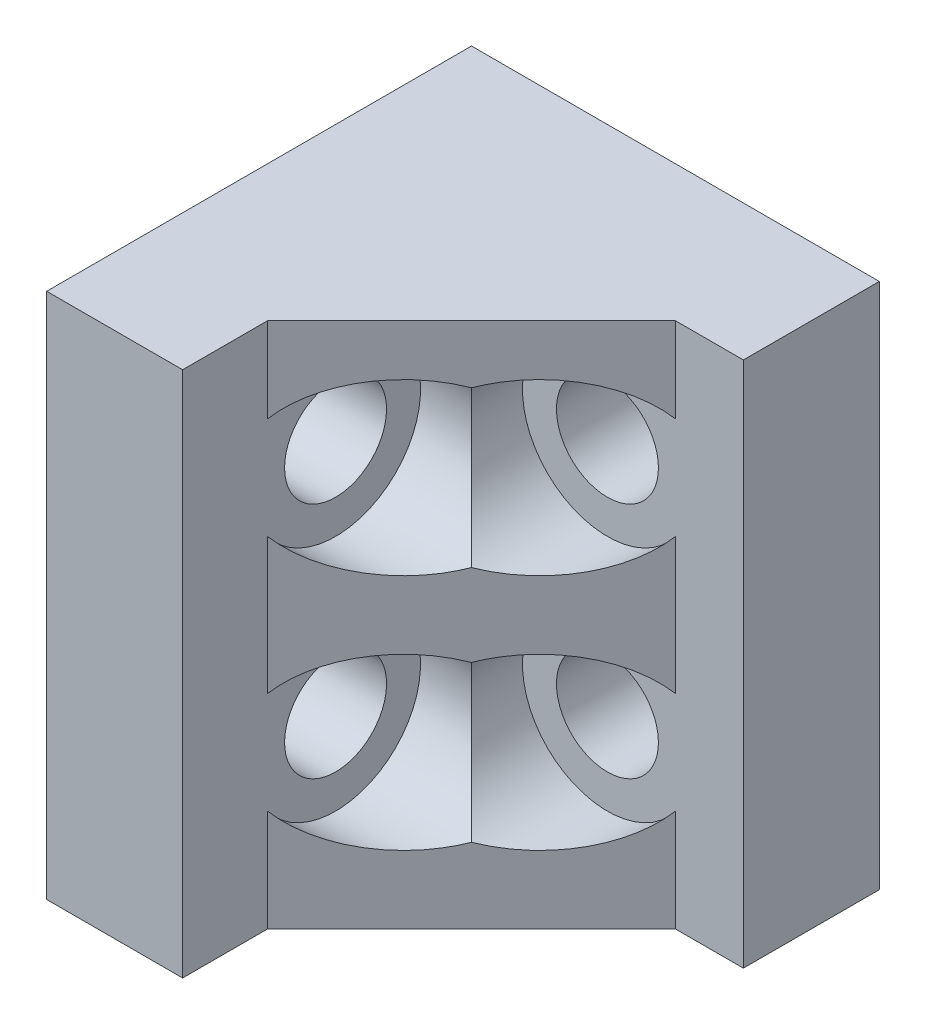
ISO-10303-21;
HEADER;
FILE_DESCRIPTION(('STEP AP214'),'2;1');
FILE_NAME('part.step','',(''),(''),'','','');
FILE_SCHEMA(('AUTOMOTIVE_DESIGN { 1 0 10303 214 1 1 1 1 }'));
ENDSEC;
DATA;
#1=APPLICATION_CONTEXT('core data for automotive mechanical design processes');
#2=APPLICATION_PROTOCOL_DEFINITION('international standard','automotive_design',2000,#1);
#3=PRODUCT_CONTEXT('',#1,'mechanical');
#4=PRODUCT('Part','Part','',(#3));
#5=PRODUCT_RELATED_PRODUCT_CATEGORY('part','',(#4));
#6=PRODUCT_DEFINITION_FORMATION('','',#4);
#7=PRODUCT_DEFINITION_CONTEXT('part definition',#1,'design');
#8=PRODUCT_DEFINITION('design','',#6,#7);
#9=PRODUCT_DEFINITION_SHAPE('','',#8);
#10=(LENGTH_UNIT() NAMED_UNIT(*) SI_UNIT(.MILLI.,.METRE.));
#11=(NAMED_UNIT(*) PLANE_ANGLE_UNIT() SI_UNIT($,.RADIAN.));
#12=(NAMED_UNIT(*) SI_UNIT($,.STERADIAN.) SOLID_ANGLE_UNIT());
#13=UNCERTAINTY_MEASURE_WITH_UNIT(LENGTH_MEASURE(1.E-05),#10,'distance_accuracy_value','');
#14=(GEOMETRIC_REPRESENTATION_CONTEXT(3) GLOBAL_UNCERTAINTY_ASSIGNED_CONTEXT((#13)) GLOBAL_UNIT_ASSIGNED_CONTEXT((#10,
#11,#12)) REPRESENTATION_CONTEXT('',''));
#15=CARTESIAN_POINT('',(0.,0.,0.));
#16=DIRECTION('',(0.,0.,1.));
#17=DIRECTION('',(1.,0.,0.));
#18=AXIS2_PLACEMENT_3D('',#15,#16,#17);
#19=CARTESIAN_POINT('',(5.78038521638798,20.3469783539631,10.));
#20=DIRECTION('',(0.707106781186548,0.,0.707106781186548));
#21=DIRECTION('',(0.707106781186548,0.,-0.707106781186548));
#22=AXIS2_PLACEMENT_3D('',#19,#20,#21);
#23=PLANE('',#22);
#24=CARTESIAN_POINT('',(9.78038521638798,31.8469783539631,6.));
#25=DIRECTION('',(0.707106781186548,0.,0.707106781186548));
#26=DIRECTION('',(-0.707106781186548,0.,0.707106781186548));
#27=AXIS2_PLACEMENT_3D('',#24,#25,#26);
#28=ELLIPSE('',#27,3.53553390593274,2.5);
#29=CARTESIAN_POINT('',(8.78038521638798,29.5556905064852,7.));
#30=VERTEX_POINT('',#29);
#31=CARTESIAN_POINT('',(11.780385216388,30.3469783539631,4.));
#32=VERTEX_POINT('',#31);
#33=EDGE_CURVE('E135',#30,#32,#28,.T.);
#34=ORIENTED_EDGE('',*,*,#33,.F.);
#35=CARTESIAN_POINT('',(7.78038521638798,31.8469783539631,8.));
#36=DIRECTION('',(0.707106781186548,0.,0.707106781186548));
#37=DIRECTION('',(0.707106781186548,0.,-0.707106781186548));
#38=AXIS2_PLACEMENT_3D('',#35,#36,#37);
#39=ELLIPSE('',#38,3.53553390593274,2.5);
#40=CARTESIAN_POINT('',(5.78038521638798,30.3469783539631,10.));
#41=VERTEX_POINT('',#40);
#42=EDGE_CURVE('E195',#41,#30,#39,.T.);
#43=ORIENTED_EDGE('',*,*,#42,.F.);
#44=DIRECTION('',(0.,1.,0.));
#45=VECTOR('',#44,1.);
#46=CARTESIAN_POINT('',(5.78038521638798,20.3469783539631,10.));
#47=LINE('',#46,#45);
#48=CARTESIAN_POINT('',(5.78038521638798,26.3469783539631,10.));
#49=VERTEX_POINT('',#48);
#50=EDGE_CURVE('E166',#49,#41,#47,.T.);
#51=ORIENTED_EDGE('',*,*,#50,.F.);
#52=CARTESIAN_POINT('',(7.78038521638798,24.8469783539631,8.));
#53=DIRECTION('',(0.707106781186548,0.,0.707106781186548));
#54=DIRECTION('',(0.707106781186548,0.,-0.707106781186548));
#55=AXIS2_PLACEMENT_3D('',#52,#53,#54);
#56=ELLIPSE('',#55,3.53553390593273,2.5);
#57=CARTESIAN_POINT('',(8.78038521638798,27.138266201441,7.));
#58=VERTEX_POINT('',#57);
#59=EDGE_CURVE('E194',#58,#49,#56,.T.);
#60=ORIENTED_EDGE('',*,*,#59,.F.);
#61=CARTESIAN_POINT('',(9.78038521638798,24.8469783539631,6.));
#62=DIRECTION('',(0.707106781186548,0.,0.707106781186548));
#63=DIRECTION('',(-0.707106781186548,0.,0.707106781186548));
#64=AXIS2_PLACEMENT_3D('',#61,#62,#63);
#65=ELLIPSE('',#64,3.53553390593274,2.5);
#66=CARTESIAN_POINT('',(11.780385216388,26.3469783539631,4.));
#67=VERTEX_POINT('',#66);
#68=EDGE_CURVE('E55',#67,#58,#65,.T.);
#69=ORIENTED_EDGE('',*,*,#68,.F.);
#70=DIRECTION('',(0.,1.,0.));
#71=VECTOR('',#70,1.);
#72=CARTESIAN_POINT('',(11.780385216388,20.3469783539631,4.));
#73=LINE('',#72,#71);
#74=EDGE_CURVE('E159',#67,#32,#73,.T.);
#75=ORIENTED_EDGE('',*,*,#74,.T.);
#76=EDGE_LOOP('',(#34,#43,#51,#60,#69,#75));
#77=FACE_BOUND('',#76,.T.);
#78=ADVANCED_FACE('F39',(#77),#23,.T.);
#79=CARTESIAN_POINT('',(8.78038521638798,22.5556905064852,7.));
#80=VERTEX_POINT('',#79);
#81=CARTESIAN_POINT('',(11.780385216388,23.3469783539631,4.));
#82=VERTEX_POINT('',#81);
#83=EDGE_CURVE('E208',#80,#82,#65,.T.);
#84=ORIENTED_EDGE('',*,*,#83,.F.);
#85=CARTESIAN_POINT('',(5.78038521638798,23.3469783539631,10.));
#86=VERTEX_POINT('',#85);
#87=EDGE_CURVE('E190',#86,#80,#56,.T.);
#88=ORIENTED_EDGE('',*,*,#87,.F.);
#89=CARTESIAN_POINT('',(5.78038521638798,20.3469783539631,10.));
#90=VERTEX_POINT('',#89);
#91=EDGE_CURVE('E160',#90,#86,#47,.T.);
#92=ORIENTED_EDGE('',*,*,#91,.F.);
#93=DIRECTION('',(0.707106781186548,0.,-0.707106781186548));
#94=VECTOR('',#93,1.);
#95=CARTESIAN_POINT('',(5.78038521638798,20.3469783539631,10.));
#96=LINE('',#95,#94);
#97=CARTESIAN_POINT('',(11.780385216388,20.3469783539631,4.));
#98=VERTEX_POINT('',#97);
#99=EDGE_CURVE('E221',#90,#98,#96,.T.);
#100=ORIENTED_EDGE('',*,*,#99,.T.);
#101=EDGE_CURVE('E162',#98,#82,#73,.T.);
#102=ORIENTED_EDGE('',*,*,#101,.T.);
#103=EDGE_LOOP('',(#84,#88,#92,#100,#102));
#104=FACE_BOUND('',#103,.T.);
#105=ADVANCED_FACE('F340',(#104),#23,.T.);
#106=CARTESIAN_POINT('',(1.78038521638798,35.8469783539631,4.));
#107=DIRECTION('',(1.,0.,0.));
#108=DIRECTION('',(0.,1.,0.));
#109=AXIS2_PLACEMENT_3D('',#106,#107,#108);
#110=PLANE('',#109);
#111=CARTESIAN_POINT('',(1.78038521638798,24.8469783539631,8.));
#112=DIRECTION('',(1.,0.,0.));
#113=DIRECTION('',(0.,1.,0.));
#114=AXIS2_PLACEMENT_3D('',#111,#112,#113);
#115=CIRCLE('',#114,1.5);
#116=CARTESIAN_POINT('',(1.78038521638798,26.3469783539631,8.));
#117=VERTEX_POINT('',#116);
#118=EDGE_CURVE('E241',#117,#117,#115,.T.);
#119=ORIENTED_EDGE('',*,*,#118,.T.);
#120=EDGE_LOOP('',(#119));
#121=FACE_BOUND('',#120,.T.);
#122=CARTESIAN_POINT('',(1.78038521638798,31.8469783539631,8.));
#123=DIRECTION('',(1.,0.,0.));
#124=DIRECTION('',(0.,1.,0.));
#125=AXIS2_PLACEMENT_3D('',#122,#123,#124);
#126=CIRCLE('',#125,1.5);
#127=CARTESIAN_POINT('',(1.78038521638798,33.3469783539631,8.));
#128=VERTEX_POINT('',#127);
#129=EDGE_CURVE('E184',#128,#128,#126,.T.);
#130=ORIENTED_EDGE('',*,*,#129,.T.);
#131=EDGE_LOOP('',(#130));
#132=FACE_BOUND('',#131,.T.);
#133=DIRECTION('',(0.,-1.,0.));
#134=VECTOR('',#133,1.);
#135=CARTESIAN_POINT('',(1.78038521638798,35.8469783539631,0.));
#136=LINE('',#135,#134);
#137=CARTESIAN_POINT('',(1.78038521638798,35.8469783539631,0.));
#138=VERTEX_POINT('',#137);
#139=CARTESIAN_POINT('',(1.78038521638798,20.3469783539631,0.));
#140=VERTEX_POINT('',#139);
#141=EDGE_CURVE('E266',#138,#140,#136,.T.);
#142=ORIENTED_EDGE('',*,*,#141,.T.);
#143=DIRECTION('',(0.,0.,-1.));
#144=VECTOR('',#143,1.);
#145=CARTESIAN_POINT('',(1.78038521638798,20.3469783539631,4.));
#146=LINE('',#145,#144);
#147=CARTESIAN_POINT('',(1.78038521638798,20.3469783539631,12.5));
#148=VERTEX_POINT('',#147);
#149=EDGE_CURVE('E187',#148,#140,#146,.T.);
#150=ORIENTED_EDGE('',*,*,#149,.F.);
#151=DIRECTION('',(0.,-1.,0.));
#152=VECTOR('',#151,1.);
#153=CARTESIAN_POINT('',(1.78038521638798,20.3469783539631,12.5));
#154=LINE('',#153,#152);
#155=CARTESIAN_POINT('',(1.78038521638798,35.8469783539631,12.5));
#156=VERTEX_POINT('',#155);
#157=EDGE_CURVE('E245',#156,#148,#154,.T.);
#158=ORIENTED_EDGE('',*,*,#157,.F.);
#159=DIRECTION('',(0.,0.,-1.));
#160=VECTOR('',#159,1.);
#161=CARTESIAN_POINT('',(1.78038521638798,35.8469783539631,4.));
#162=LINE('',#161,#160);
#163=EDGE_CURVE('E276',#156,#138,#162,.T.);
#164=ORIENTED_EDGE('',*,*,#163,.T.);
#165=EDGE_LOOP('',(#142,#150,#158,#164));
#166=FACE_BOUND('',#165,.T.);
#167=ADVANCED_FACE('F41',(#121,#132,#166),#110,.F.);
#168=CARTESIAN_POINT('',(1.78038521638798,20.3469783539631,4.));
#169=DIRECTION('',(0.,1.,0.));
#170=DIRECTION('',(0.,0.,1.));
#171=AXIS2_PLACEMENT_3D('',#168,#169,#170);
#172=PLANE('',#171);
#173=DIRECTION('',(1.,0.,0.));
#174=VECTOR('',#173,1.);
#175=CARTESIAN_POINT('',(1.78038521638798,20.3469783539631,4.));
#176=LINE('',#175,#174);
#177=CARTESIAN_POINT('',(13.780385216388,20.3469783539631,4.));
#178=VERTEX_POINT('',#177);
#179=EDGE_CURVE('E267',#98,#178,#176,.T.);
#180=ORIENTED_EDGE('',*,*,#179,.F.);
#181=ORIENTED_EDGE('',*,*,#99,.F.);
#182=DIRECTION('',(0.,0.,-1.));
#183=VECTOR('',#182,1.);
#184=CARTESIAN_POINT('',(5.78038521638798,20.3469783539631,12.5));
#185=LINE('',#184,#183);
#186=CARTESIAN_POINT('',(5.78038521638798,20.3469783539631,12.5));
#187=VERTEX_POINT('',#186);
#188=EDGE_CURVE('E262',#187,#90,#185,.T.);
#189=ORIENTED_EDGE('',*,*,#188,.F.);
#190=DIRECTION('',(1.,0.,0.));
#191=VECTOR('',#190,1.);
#192=CARTESIAN_POINT('',(1.78038521638798,20.3469783539631,12.5));
#193=LINE('',#192,#191);
#194=EDGE_CURVE('E249',#148,#187,#193,.T.);
#195=ORIENTED_EDGE('',*,*,#194,.F.);
#196=ORIENTED_EDGE('',*,*,#149,.T.);
#197=DIRECTION('',(1.,0.,0.));
#198=VECTOR('',#197,1.);
#199=CARTESIAN_POINT('',(1.78038521638798,20.3469783539631,0.));
#200=LINE('',#199,#198);
#201=CARTESIAN_POINT('',(13.780385216388,20.3469783539631,0.));
#202=VERTEX_POINT('',#201);
#203=EDGE_CURVE('E280',#140,#202,#200,.T.);
#204=ORIENTED_EDGE('',*,*,#203,.T.);
#205=DIRECTION('',(0.,0.,-1.));
#206=VECTOR('',#205,1.);
#207=CARTESIAN_POINT('',(13.780385216388,20.3469783539631,4.));
#208=LINE('',#207,#206);
#209=EDGE_CURVE('E294',#178,#202,#208,.T.);
#210=ORIENTED_EDGE('',*,*,#209,.F.);
#211=EDGE_LOOP('',(#180,#181,#189,#195,#196,#204,#210));
#212=FACE_BOUND('',#211,.T.);
#213=ADVANCED_FACE('F406',(#212),#172,.F.);
#214=CARTESIAN_POINT('',(13.780385216388,35.8469783539631,4.));
#215=DIRECTION('',(-1.,0.,0.));
#216=DIRECTION('',(0.,-1.,0.));
#217=AXIS2_PLACEMENT_3D('',#214,#215,#216);
#218=PLANE('',#217);
#219=DIRECTION('',(0.,1.,0.));
#220=VECTOR('',#219,1.);
#221=CARTESIAN_POINT('',(13.780385216388,35.8469783539631,0.));
#222=LINE('',#221,#220);
#223=CARTESIAN_POINT('',(13.780385216388,35.8469783539631,0.));
#224=VERTEX_POINT('',#223);
#225=EDGE_CURVE('E283',#202,#224,#222,.T.);
#226=ORIENTED_EDGE('',*,*,#225,.T.);
#227=DIRECTION('',(0.,0.,-1.));
#228=VECTOR('',#227,1.);
#229=CARTESIAN_POINT('',(13.780385216388,35.8469783539631,4.));
#230=LINE('',#229,#228);
#231=CARTESIAN_POINT('',(13.780385216388,35.8469783539631,4.));
#232=VERTEX_POINT('',#231);
#233=EDGE_CURVE('E291',#232,#224,#230,.T.);
#234=ORIENTED_EDGE('',*,*,#233,.F.);
#235=DIRECTION('',(0.,1.,0.));
#236=VECTOR('',#235,1.);
#237=CARTESIAN_POINT('',(13.780385216388,35.8469783539631,4.));
#238=LINE('',#237,#236);
#239=EDGE_CURVE('E270',#178,#232,#238,.T.);
#240=ORIENTED_EDGE('',*,*,#239,.F.);
#241=ORIENTED_EDGE('',*,*,#209,.T.);
#242=EDGE_LOOP('',(#226,#234,#240,#241));
#243=FACE_BOUND('',#242,.T.);
#244=ADVANCED_FACE('F336',(#243),#218,.F.);
#245=CARTESIAN_POINT('',(1.78038521638798,35.8469783539631,4.));
#246=DIRECTION('',(0.,-1.,0.));
#247=DIRECTION('',(0.,0.,-1.));
#248=AXIS2_PLACEMENT_3D('',#245,#246,#247);
#249=PLANE('',#248);
#250=DIRECTION('',(-1.,0.,0.));
#251=VECTOR('',#250,1.);
#252=CARTESIAN_POINT('',(1.78038521638798,35.8469783539631,0.));
#253=LINE('',#252,#251);
#254=EDGE_CURVE('E271',#224,#138,#253,.T.);
#255=ORIENTED_EDGE('',*,*,#254,.T.);
#256=ORIENTED_EDGE('',*,*,#163,.F.);
#257=DIRECTION('',(-1.,0.,0.));
#258=VECTOR('',#257,1.);
#259=CARTESIAN_POINT('',(1.78038521638798,35.8469783539631,12.5));
#260=LINE('',#259,#258);
#261=CARTESIAN_POINT('',(5.78038521638798,35.8469783539631,12.5));
#262=VERTEX_POINT('',#261);
#263=EDGE_CURVE('E255',#262,#156,#260,.T.);
#264=ORIENTED_EDGE('',*,*,#263,.F.);
#265=DIRECTION('',(0.,0.,-1.));
#266=VECTOR('',#265,1.);
#267=CARTESIAN_POINT('',(5.78038521638798,35.8469783539631,12.5));
#268=LINE('',#267,#266);
#269=CARTESIAN_POINT('',(5.78038521638798,35.8469783539631,10.));
#270=VERTEX_POINT('',#269);
#271=EDGE_CURVE('E259',#262,#270,#268,.T.);
#272=ORIENTED_EDGE('',*,*,#271,.T.);
#273=DIRECTION('',(0.707106781186548,0.,-0.707106781186548));
#274=VECTOR('',#273,1.);
#275=CARTESIAN_POINT('',(5.78038521638798,35.8469783539631,10.));
#276=LINE('',#275,#274);
#277=CARTESIAN_POINT('',(11.780385216388,35.8469783539631,4.));
#278=VERTEX_POINT('',#277);
#279=EDGE_CURVE('E223',#270,#278,#276,.T.);
#280=ORIENTED_EDGE('',*,*,#279,.T.);
#281=DIRECTION('',(-1.,0.,0.));
#282=VECTOR('',#281,1.);
#283=CARTESIAN_POINT('',(1.78038521638798,35.8469783539631,4.));
#284=LINE('',#283,#282);
#285=EDGE_CURVE('E157',#232,#278,#284,.T.);
#286=ORIENTED_EDGE('',*,*,#285,.F.);
#287=ORIENTED_EDGE('',*,*,#233,.T.);
#288=EDGE_LOOP('',(#255,#256,#264,#272,#280,#286,#287));
#289=FACE_BOUND('',#288,.T.);
#290=ADVANCED_FACE('F328',(#289),#249,.F.);
#291=CARTESIAN_POINT('',(0.,0.,4.));
#292=DIRECTION('',(0.,0.,1.));
#293=DIRECTION('',(1.,0.,0.));
#294=AXIS2_PLACEMENT_3D('',#291,#292,#293);
#295=PLANE('',#294);
#296=CARTESIAN_POINT('',(11.780385216388,33.3469783539631,4.));
#297=VERTEX_POINT('',#296);
#298=EDGE_CURVE('E147',#297,#278,#73,.T.);
#299=ORIENTED_EDGE('',*,*,#298,.F.);
#300=CARTESIAN_POINT('',(9.78038521638798,31.8469783539631,4.));
#301=DIRECTION('',(0.,0.,1.));
#302=DIRECTION('',(1.,0.,0.));
#303=AXIS2_PLACEMENT_3D('',#300,#301,#302);
#304=CIRCLE('',#303,2.5);
#305=EDGE_CURVE('E132',#297,#32,#304,.T.);
#306=ORIENTED_EDGE('',*,*,#305,.T.);
#307=ORIENTED_EDGE('',*,*,#74,.F.);
#308=CARTESIAN_POINT('',(9.78038521638798,24.8469783539631,4.));
#309=DIRECTION('',(0.,0.,1.));
#310=DIRECTION('',(1.,0.,0.));
#311=AXIS2_PLACEMENT_3D('',#308,#309,#310);
#312=CIRCLE('',#311,2.5);
#313=EDGE_CURVE('E141',#67,#82,#312,.T.);
#314=ORIENTED_EDGE('',*,*,#313,.T.);
#315=ORIENTED_EDGE('',*,*,#101,.F.);
#316=ORIENTED_EDGE('',*,*,#179,.T.);
#317=ORIENTED_EDGE('',*,*,#239,.T.);
#318=ORIENTED_EDGE('',*,*,#285,.T.);
#319=EDGE_LOOP('',(#299,#306,#307,#314,#315,#316,#317,#318));
#320=FACE_BOUND('',#319,.T.);
#321=CARTESIAN_POINT('',(9.78038521638798,24.8469783539631,4.));
#322=DIRECTION('',(0.,0.,-1.));
#323=DIRECTION('',(-1.,0.,0.));
#324=AXIS2_PLACEMENT_3D('',#321,#322,#323);
#325=CIRCLE('',#324,1.5);
#326=CARTESIAN_POINT('',(8.28038521638798,24.8469783539631,4.));
#327=VERTEX_POINT('',#326);
#328=EDGE_CURVE('E316',#327,#327,#325,.F.);
#329=ORIENTED_EDGE('',*,*,#328,.F.);
#330=EDGE_LOOP('',(#329));
#331=FACE_BOUND('',#330,.T.);
#332=CARTESIAN_POINT('',(9.78038521638798,31.8469783539631,4.));
#333=DIRECTION('',(0.,0.,-1.));
#334=DIRECTION('',(-1.,0.,0.));
#335=AXIS2_PLACEMENT_3D('',#332,#333,#334);
#336=CIRCLE('',#335,1.5);
#337=CARTESIAN_POINT('',(8.28038521638797,31.8469783539631,4.));
#338=VERTEX_POINT('',#337);
#339=EDGE_CURVE('E220',#338,#338,#336,.F.);
#340=ORIENTED_EDGE('',*,*,#339,.F.);
#341=EDGE_LOOP('',(#340));
#342=FACE_BOUND('',#341,.T.);
#343=ADVANCED_FACE('F154',(#320,#331,#342),#295,.T.);
#344=CARTESIAN_POINT('',(0.,0.,0.));
#345=DIRECTION('',(0.,0.,1.));
#346=DIRECTION('',(1.,0.,0.));
#347=AXIS2_PLACEMENT_3D('',#344,#345,#346);
#348=PLANE('',#347);
#349=CARTESIAN_POINT('',(9.78038521638798,24.8469783539631,0.));
#350=DIRECTION('',(0.,0.,1.));
#351=DIRECTION('',(1.,0.,0.));
#352=AXIS2_PLACEMENT_3D('',#349,#350,#351);
#353=CIRCLE('',#352,1.5);
#354=CARTESIAN_POINT('',(11.280385216388,24.8469783539631,0.));
#355=VERTEX_POINT('',#354);
#356=EDGE_CURVE('E178',#355,#355,#353,.T.);
#357=ORIENTED_EDGE('',*,*,#356,.T.);
#358=EDGE_LOOP('',(#357));
#359=FACE_BOUND('',#358,.T.);
#360=CARTESIAN_POINT('',(9.78038521638798,31.8469783539631,0.));
#361=DIRECTION('',(0.,0.,1.));
#362=DIRECTION('',(1.,0.,0.));
#363=AXIS2_PLACEMENT_3D('',#360,#361,#362);
#364=CIRCLE('',#363,1.5);
#365=CARTESIAN_POINT('',(11.280385216388,31.8469783539631,0.));
#366=VERTEX_POINT('',#365);
#367=EDGE_CURVE('E172',#366,#366,#364,.T.);
#368=ORIENTED_EDGE('',*,*,#367,.T.);
#369=EDGE_LOOP('',(#368));
#370=FACE_BOUND('',#369,.T.);
#371=ORIENTED_EDGE('',*,*,#141,.F.);
#372=ORIENTED_EDGE('',*,*,#254,.F.);
#373=ORIENTED_EDGE('',*,*,#225,.F.);
#374=ORIENTED_EDGE('',*,*,#203,.F.);
#375=EDGE_LOOP('',(#371,#372,#373,#374));
#376=FACE_BOUND('',#375,.T.);
#377=ADVANCED_FACE('F327',(#359,#370,#376),#348,.F.);
#378=CARTESIAN_POINT('',(5.78038521638798,20.3469783539631,12.5));
#379=DIRECTION('',(-1.,0.,0.));
#380=DIRECTION('',(0.,0.,1.));
#381=AXIS2_PLACEMENT_3D('',#378,#379,#380);
#382=PLANE('',#381);
#383=ORIENTED_EDGE('',*,*,#50,.T.);
#384=CARTESIAN_POINT('',(5.78038521638798,31.8469783539631,8.));
#385=DIRECTION('',(1.,0.,0.));
#386=DIRECTION('',(0.,1.,0.));
#387=AXIS2_PLACEMENT_3D('',#384,#385,#386);
#388=CIRCLE('',#387,2.5);
#389=CARTESIAN_POINT('',(5.78038521638798,33.3469783539631,10.));
#390=VERTEX_POINT('',#389);
#391=EDGE_CURVE('E212',#41,#390,#388,.T.);
#392=ORIENTED_EDGE('',*,*,#391,.T.);
#393=EDGE_CURVE('E168',#390,#270,#47,.T.);
#394=ORIENTED_EDGE('',*,*,#393,.T.);
#395=ORIENTED_EDGE('',*,*,#271,.F.);
#396=DIRECTION('',(0.,1.,0.));
#397=VECTOR('',#396,1.);
#398=CARTESIAN_POINT('',(5.78038521638798,20.3469783539631,12.5));
#399=LINE('',#398,#397);
#400=EDGE_CURVE('E252',#187,#262,#399,.T.);
#401=ORIENTED_EDGE('',*,*,#400,.F.);
#402=ORIENTED_EDGE('',*,*,#188,.T.);
#403=ORIENTED_EDGE('',*,*,#91,.T.);
#404=CARTESIAN_POINT('',(5.78038521638798,24.8469783539631,8.));
#405=DIRECTION('',(1.,0.,0.));
#406=DIRECTION('',(0.,1.,0.));
#407=AXIS2_PLACEMENT_3D('',#404,#405,#406);
#408=CIRCLE('',#407,2.5);
#409=EDGE_CURVE('E216',#86,#49,#408,.T.);
#410=ORIENTED_EDGE('',*,*,#409,.T.);
#411=EDGE_LOOP('',(#383,#392,#394,#395,#401,#402,#403,#410));
#412=FACE_BOUND('',#411,.T.);
#413=CARTESIAN_POINT('',(5.78038521638798,24.8469783539631,8.));
#414=DIRECTION('',(-1.,0.,0.));
#415=DIRECTION('',(0.,0.,1.));
#416=AXIS2_PLACEMENT_3D('',#413,#414,#415);
#417=CIRCLE('',#416,1.5);
#418=CARTESIAN_POINT('',(5.78038521638798,24.8469783539631,9.5));
#419=VERTEX_POINT('',#418);
#420=EDGE_CURVE('E215',#419,#419,#417,.F.);
#421=ORIENTED_EDGE('',*,*,#420,.F.);
#422=EDGE_LOOP('',(#421));
#423=FACE_BOUND('',#422,.T.);
#424=CARTESIAN_POINT('',(5.78038521638798,31.8469783539631,8.));
#425=DIRECTION('',(-1.,0.,0.));
#426=DIRECTION('',(0.,0.,1.));
#427=AXIS2_PLACEMENT_3D('',#424,#425,#426);
#428=CIRCLE('',#427,1.5);
#429=CARTESIAN_POINT('',(5.78038521638798,31.8469783539631,9.5));
#430=VERTEX_POINT('',#429);
#431=EDGE_CURVE('E225',#430,#430,#428,.F.);
#432=ORIENTED_EDGE('',*,*,#431,.F.);
#433=EDGE_LOOP('',(#432));
#434=FACE_BOUND('',#433,.T.);
#435=ADVANCED_FACE('F311',(#412,#423,#434),#382,.F.);
#436=CARTESIAN_POINT('',(0.,0.,12.5));
#437=DIRECTION('',(0.,0.,-1.));
#438=DIRECTION('',(-1.,0.,0.));
#439=AXIS2_PLACEMENT_3D('',#436,#437,#438);
#440=PLANE('',#439);
#441=ORIENTED_EDGE('',*,*,#157,.T.);
#442=ORIENTED_EDGE('',*,*,#194,.T.);
#443=ORIENTED_EDGE('',*,*,#400,.T.);
#444=ORIENTED_EDGE('',*,*,#263,.T.);
#445=EDGE_LOOP('',(#441,#442,#443,#444));
#446=FACE_BOUND('',#445,.T.);
#447=ADVANCED_FACE('F367',(#446),#440,.F.);
#448=CARTESIAN_POINT('',(0.780385216387978,31.8469783539631,8.));
#449=DIRECTION('',(1.,0.,0.));
#450=DIRECTION('',(0.,0.,-1.));
#451=AXIS2_PLACEMENT_3D('',#448,#449,#450);
#452=CYLINDRICAL_SURFACE('',#451,1.5);
#453=ORIENTED_EDGE('',*,*,#431,.T.);
#454=EDGE_LOOP('',(#453));
#455=FACE_BOUND('',#454,.T.);
#456=ORIENTED_EDGE('',*,*,#129,.F.);
#457=EDGE_LOOP('',(#456));
#458=FACE_BOUND('',#457,.T.);
#459=ADVANCED_FACE('F363',(#455,#458),#452,.F.);
#460=CARTESIAN_POINT('',(0.780385216387978,24.8469783539631,8.));
#461=DIRECTION('',(1.,0.,0.));
#462=DIRECTION('',(0.,0.,-1.));
#463=AXIS2_PLACEMENT_3D('',#460,#461,#462);
#464=CYLINDRICAL_SURFACE('',#463,1.5);
#465=ORIENTED_EDGE('',*,*,#420,.T.);
#466=EDGE_LOOP('',(#465));
#467=FACE_BOUND('',#466,.T.);
#468=ORIENTED_EDGE('',*,*,#118,.F.);
#469=EDGE_LOOP('',(#468));
#470=FACE_BOUND('',#469,.T.);
#471=ADVANCED_FACE('F357',(#467,#470),#464,.F.);
#472=CARTESIAN_POINT('',(9.78038521638798,31.8469783539631,-1.));
#473=DIRECTION('',(0.,0.,1.));
#474=DIRECTION('',(1.,0.,0.));
#475=AXIS2_PLACEMENT_3D('',#472,#473,#474);
#476=CYLINDRICAL_SURFACE('',#475,1.5);
#477=ORIENTED_EDGE('',*,*,#339,.T.);
#478=EDGE_LOOP('',(#477));
#479=FACE_BOUND('',#478,.T.);
#480=ORIENTED_EDGE('',*,*,#367,.F.);
#481=EDGE_LOOP('',(#480));
#482=FACE_BOUND('',#481,.T.);
#483=ADVANCED_FACE('F323',(#479,#482),#476,.F.);
#484=CARTESIAN_POINT('',(9.78038521638798,24.8469783539631,-1.));
#485=DIRECTION('',(0.,0.,1.));
#486=DIRECTION('',(1.,0.,0.));
#487=AXIS2_PLACEMENT_3D('',#484,#485,#486);
#488=CYLINDRICAL_SURFACE('',#487,1.5);
#489=ORIENTED_EDGE('',*,*,#328,.T.);
#490=EDGE_LOOP('',(#489));
#491=FACE_BOUND('',#490,.T.);
#492=ORIENTED_EDGE('',*,*,#356,.F.);
#493=EDGE_LOOP('',(#492));
#494=FACE_BOUND('',#493,.T.);
#495=ADVANCED_FACE('F348',(#491,#494),#488,.F.);
#496=CARTESIAN_POINT('',(8.78038521638798,34.138266201441,7.));
#497=VERTEX_POINT('',#496);
#498=EDGE_CURVE('E62',#297,#497,#28,.T.);
#499=ORIENTED_EDGE('',*,*,#498,.F.);
#500=ORIENTED_EDGE('',*,*,#298,.T.);
#501=ORIENTED_EDGE('',*,*,#279,.F.);
#502=ORIENTED_EDGE('',*,*,#393,.F.);
#503=EDGE_CURVE('E150',#497,#390,#39,.T.);
#504=ORIENTED_EDGE('',*,*,#503,.F.);
#505=EDGE_LOOP('',(#499,#500,#501,#502,#504));
#506=FACE_BOUND('',#505,.T.);
#507=ADVANCED_FACE('F145',(#506),#23,.T.);
#508=CARTESIAN_POINT('',(5.78038521638798,24.8469783539631,8.));
#509=DIRECTION('',(1.,0.,0.));
#510=DIRECTION('',(0.,1.,0.));
#511=AXIS2_PLACEMENT_3D('',#508,#509,#510);
#512=CYLINDRICAL_SURFACE('',#511,2.5);
#513=ORIENTED_EDGE('',*,*,#87,.T.);
#514=CARTESIAN_POINT('',(9.78038521638798,24.8469783539631,8.));
#515=DIRECTION('',(0.707106781186547,0.,-0.707106781186547));
#516=DIRECTION('',(0.707106781186547,0.,0.707106781186547));
#517=AXIS2_PLACEMENT_3D('',#514,#515,#516);
#518=ELLIPSE('',#517,3.53553390593274,2.5);
#519=EDGE_CURVE('E11',#80,#58,#518,.T.);
#520=ORIENTED_EDGE('',*,*,#519,.T.);
#521=ORIENTED_EDGE('',*,*,#59,.T.);
#522=ORIENTED_EDGE('',*,*,#409,.F.);
#523=EDGE_LOOP('',(#513,#520,#521,#522));
#524=FACE_BOUND('',#523,.T.);
#525=ADVANCED_FACE('F308',(#524),#512,.F.);
#526=CARTESIAN_POINT('',(5.78038521638798,31.8469783539631,8.));
#527=DIRECTION('',(1.,0.,0.));
#528=DIRECTION('',(0.,1.,0.));
#529=AXIS2_PLACEMENT_3D('',#526,#527,#528);
#530=CYLINDRICAL_SURFACE('',#529,2.5);
#531=ORIENTED_EDGE('',*,*,#42,.T.);
#532=CARTESIAN_POINT('',(9.78038521638798,31.8469783539631,8.));
#533=DIRECTION('',(0.707106781186547,0.,-0.707106781186547));
#534=DIRECTION('',(0.707106781186547,0.,0.707106781186547));
#535=AXIS2_PLACEMENT_3D('',#532,#533,#534);
#536=ELLIPSE('',#535,3.53553390593274,2.5);
#537=EDGE_CURVE('E48',#30,#497,#536,.T.);
#538=ORIENTED_EDGE('',*,*,#537,.T.);
#539=ORIENTED_EDGE('',*,*,#503,.T.);
#540=ORIENTED_EDGE('',*,*,#391,.F.);
#541=EDGE_LOOP('',(#531,#538,#539,#540));
#542=FACE_BOUND('',#541,.T.);
#543=ADVANCED_FACE('F200',(#542),#530,.F.);
#544=CARTESIAN_POINT('',(9.78038521638798,31.8469783539631,4.));
#545=DIRECTION('',(0.,0.,1.));
#546=DIRECTION('',(1.,0.,0.));
#547=AXIS2_PLACEMENT_3D('',#544,#545,#546);
#548=CYLINDRICAL_SURFACE('',#547,2.5);
#549=ORIENTED_EDGE('',*,*,#33,.T.);
#550=ORIENTED_EDGE('',*,*,#305,.F.);
#551=ORIENTED_EDGE('',*,*,#498,.T.);
#552=ORIENTED_EDGE('',*,*,#537,.F.);
#553=EDGE_LOOP('',(#549,#550,#551,#552));
#554=FACE_BOUND('',#553,.T.);
#555=ADVANCED_FACE('F133',(#554),#548,.F.);
#556=CARTESIAN_POINT('',(9.78038521638798,24.8469783539631,4.));
#557=DIRECTION('',(0.,0.,1.));
#558=DIRECTION('',(1.,0.,0.));
#559=AXIS2_PLACEMENT_3D('',#556,#557,#558);
#560=CYLINDRICAL_SURFACE('',#559,2.5);
#561=ORIENTED_EDGE('',*,*,#83,.T.);
#562=ORIENTED_EDGE('',*,*,#313,.F.);
#563=ORIENTED_EDGE('',*,*,#68,.T.);
#564=ORIENTED_EDGE('',*,*,#519,.F.);
#565=EDGE_LOOP('',(#561,#562,#563,#564));
#566=FACE_BOUND('',#565,.T.);
#567=ADVANCED_FACE('F487',(#566),#560,.F.);
#568=CLOSED_SHELL('',(#78,#105,#167,#213,#244,#290,#343,#377,#435,#447,#459,#471,#483,#495,#507,
#525,#543,#555,#567));
#569=MANIFOLD_SOLID_BREP('B2',#568);
#570=ADVANCED_BREP_SHAPE_REPRESENTATION('',(#18,#569),#14);
#571=SHAPE_DEFINITION_REPRESENTATION(#9,#570);
ENDSEC;
END-ISO-10303-21;
